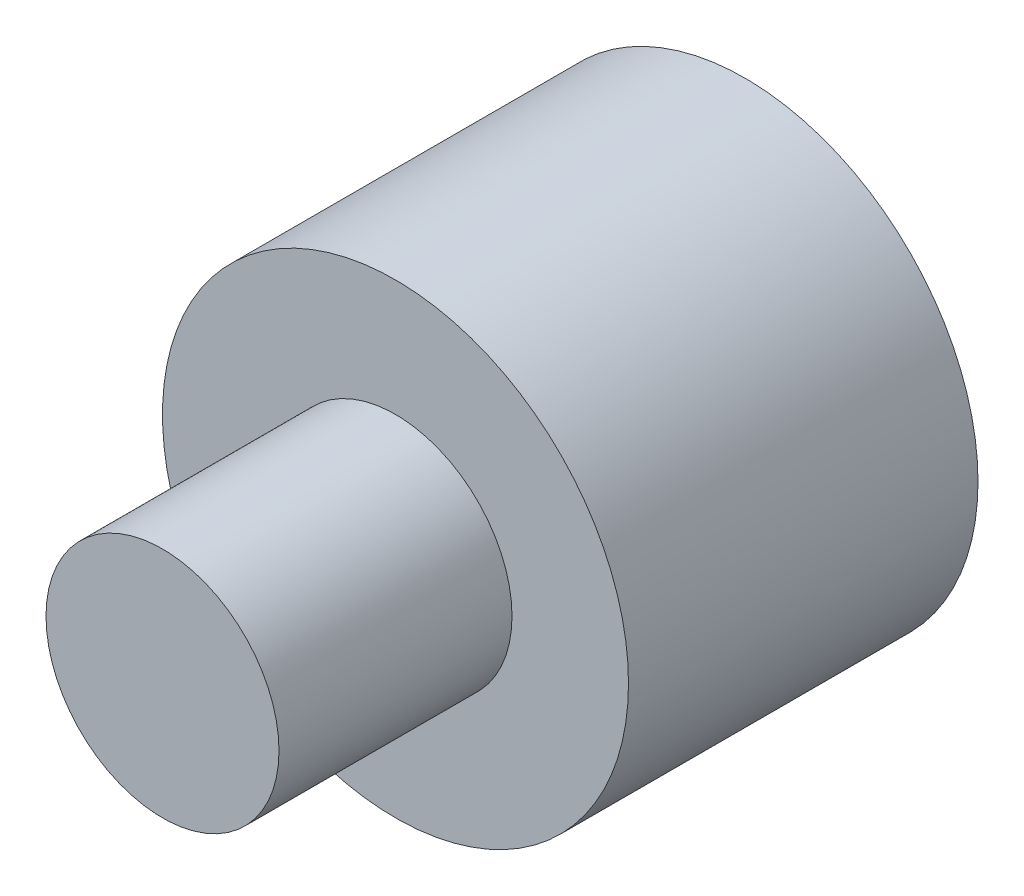
ISO-10303-21;
HEADER;
FILE_DESCRIPTION(('STEP AP214'),'2;1');
FILE_NAME('part.step','',(''),(''),'','','');
FILE_SCHEMA(('AUTOMOTIVE_DESIGN { 1 0 10303 214 1 1 1 1 }'));
ENDSEC;
DATA;
#1=APPLICATION_CONTEXT('core data for automotive mechanical design processes');
#2=APPLICATION_PROTOCOL_DEFINITION('international standard','automotive_design',2000,#1);
#3=PRODUCT_CONTEXT('',#1,'mechanical');
#4=PRODUCT('Part','Part','',(#3));
#5=PRODUCT_RELATED_PRODUCT_CATEGORY('part','',(#4));
#6=PRODUCT_DEFINITION_FORMATION('','',#4);
#7=PRODUCT_DEFINITION_CONTEXT('part definition',#1,'design');
#8=PRODUCT_DEFINITION('design','',#6,#7);
#9=PRODUCT_DEFINITION_SHAPE('','',#8);
#10=(LENGTH_UNIT() NAMED_UNIT(*) SI_UNIT(.MILLI.,.METRE.));
#11=(NAMED_UNIT(*) PLANE_ANGLE_UNIT() SI_UNIT($,.RADIAN.));
#12=(NAMED_UNIT(*) SI_UNIT($,.STERADIAN.) SOLID_ANGLE_UNIT());
#13=UNCERTAINTY_MEASURE_WITH_UNIT(LENGTH_MEASURE(1.E-05),#10,'distance_accuracy_value','');
#14=(GEOMETRIC_REPRESENTATION_CONTEXT(3) GLOBAL_UNCERTAINTY_ASSIGNED_CONTEXT((#13)) GLOBAL_UNIT_ASSIGNED_CONTEXT((#10,
#11,#12)) REPRESENTATION_CONTEXT('',''));
#15=CARTESIAN_POINT('',(0.,0.,0.));
#16=DIRECTION('',(0.,0.,1.));
#17=DIRECTION('',(1.,0.,0.));
#18=AXIS2_PLACEMENT_3D('',#15,#16,#17);
#19=CARTESIAN_POINT('',(0.,0.,30.));
#20=DIRECTION('',(0.,0.,-1.));
#21=DIRECTION('',(-1.,0.,0.));
#22=AXIS2_PLACEMENT_3D('',#19,#20,#21);
#23=CYLINDRICAL_SURFACE('',#22,20.);
#24=CARTESIAN_POINT('',(0.,0.,30.));
#25=DIRECTION('',(0.,0.,1.));
#26=DIRECTION('',(1.,0.,0.));
#27=AXIS2_PLACEMENT_3D('',#24,#25,#26);
#28=CIRCLE('',#27,20.);
#29=CARTESIAN_POINT('',(20.,0.,30.));
#30=VERTEX_POINT('',#29);
#31=EDGE_CURVE('E37',#30,#30,#28,.T.);
#32=ORIENTED_EDGE('',*,*,#31,.F.);
#33=EDGE_LOOP('',(#32));
#34=FACE_BOUND('',#33,.T.);
#35=CARTESIAN_POINT('',(0.,0.,0.));
#36=DIRECTION('',(0.,0.,1.));
#37=DIRECTION('',(1.,0.,0.));
#38=AXIS2_PLACEMENT_3D('',#35,#36,#37);
#39=CIRCLE('',#38,20.);
#40=CARTESIAN_POINT('',(20.,0.,0.));
#41=VERTEX_POINT('',#40);
#42=EDGE_CURVE('E33',#41,#41,#39,.T.);
#43=ORIENTED_EDGE('',*,*,#42,.T.);
#44=EDGE_LOOP('',(#43));
#45=FACE_BOUND('',#44,.T.);
#46=ADVANCED_FACE('F30',(#34,#45),#23,.T.);
#47=CARTESIAN_POINT('',(0.,0.,30.));
#48=DIRECTION('',(0.,0.,1.));
#49=DIRECTION('',(1.,0.,0.));
#50=AXIS2_PLACEMENT_3D('',#47,#48,#49);
#51=PLANE('',#50);
#52=CARTESIAN_POINT('',(0.,0.,30.));
#53=DIRECTION('',(0.,0.,1.));
#54=DIRECTION('',(1.,0.,0.));
#55=AXIS2_PLACEMENT_3D('',#52,#53,#54);
#56=CIRCLE('',#55,10.);
#57=CARTESIAN_POINT('',(10.,0.,30.));
#58=VERTEX_POINT('',#57);
#59=EDGE_CURVE('E10',#58,#58,#56,.T.);
#60=ORIENTED_EDGE('',*,*,#59,.F.);
#61=EDGE_LOOP('',(#60));
#62=FACE_BOUND('',#61,.T.);
#63=ORIENTED_EDGE('',*,*,#31,.T.);
#64=EDGE_LOOP('',(#63));
#65=FACE_BOUND('',#64,.T.);
#66=ADVANCED_FACE('F54',(#62,#65),#51,.T.);
#67=CARTESIAN_POINT('',(0.,0.,0.));
#68=DIRECTION('',(0.,0.,1.));
#69=DIRECTION('',(1.,0.,0.));
#70=AXIS2_PLACEMENT_3D('',#67,#68,#69);
#71=PLANE('',#70);
#72=ORIENTED_EDGE('',*,*,#42,.F.);
#73=EDGE_LOOP('',(#72));
#74=FACE_BOUND('',#73,.T.);
#75=ADVANCED_FACE('F51',(#74),#71,.F.);
#76=CARTESIAN_POINT('',(0.,0.,50.));
#77=DIRECTION('',(0.,0.,-1.));
#78=DIRECTION('',(-1.,0.,0.));
#79=AXIS2_PLACEMENT_3D('',#76,#77,#78);
#80=CYLINDRICAL_SURFACE('',#79,10.);
#81=CARTESIAN_POINT('',(0.,0.,50.));
#82=DIRECTION('',(0.,0.,1.));
#83=DIRECTION('',(1.,0.,0.));
#84=AXIS2_PLACEMENT_3D('',#81,#82,#83);
#85=CIRCLE('',#84,10.);
#86=CARTESIAN_POINT('',(10.,0.,50.));
#87=VERTEX_POINT('',#86);
#88=EDGE_CURVE('E43',#87,#87,#85,.T.);
#89=ORIENTED_EDGE('',*,*,#88,.F.);
#90=EDGE_LOOP('',(#89));
#91=FACE_BOUND('',#90,.T.);
#92=ORIENTED_EDGE('',*,*,#59,.T.);
#93=EDGE_LOOP('',(#92));
#94=FACE_BOUND('',#93,.T.);
#95=ADVANCED_FACE('F53',(#91,#94),#80,.T.);
#96=CARTESIAN_POINT('',(0.,0.,50.));
#97=DIRECTION('',(0.,0.,1.));
#98=DIRECTION('',(1.,0.,0.));
#99=AXIS2_PLACEMENT_3D('',#96,#97,#98);
#100=PLANE('',#99);
#101=ORIENTED_EDGE('',*,*,#88,.T.);
#102=EDGE_LOOP('',(#101));
#103=FACE_BOUND('',#102,.T.);
#104=ADVANCED_FACE('F59',(#103),#100,.T.);
#105=CLOSED_SHELL('',(#46,#66,#75,#95,#104));
#106=MANIFOLD_SOLID_BREP('B2',#105);
#107=ADVANCED_BREP_SHAPE_REPRESENTATION('',(#18,#106),#14);
#108=SHAPE_DEFINITION_REPRESENTATION(#9,#107);
ENDSEC;
END-ISO-10303-21;
